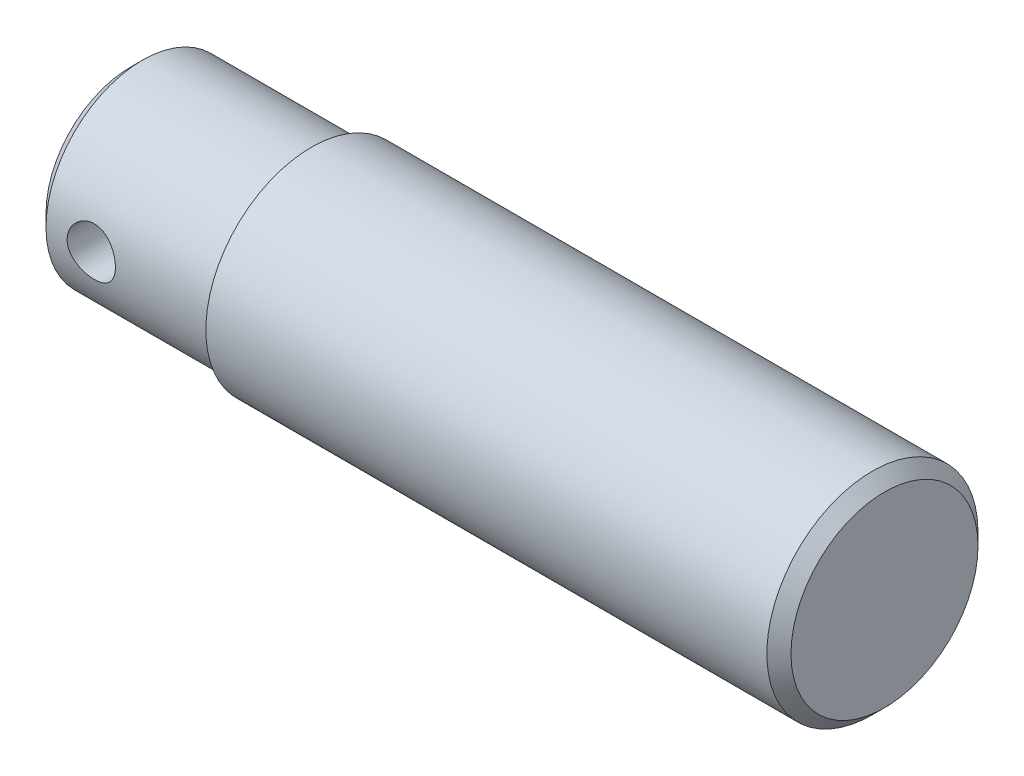
ISO-10303-21;
HEADER;
FILE_DESCRIPTION(('STEP AP214'),'2;1');
FILE_NAME('part.step','',(''),(''),'','','');
FILE_SCHEMA(('AUTOMOTIVE_DESIGN { 1 0 10303 214 1 1 1 1 }'));
ENDSEC;
DATA;
#1=APPLICATION_CONTEXT('core data for automotive mechanical design processes');
#2=APPLICATION_PROTOCOL_DEFINITION('international standard','automotive_design',2000,#1);
#3=PRODUCT_CONTEXT('',#1,'mechanical');
#4=PRODUCT('Part','Part','',(#3));
#5=PRODUCT_RELATED_PRODUCT_CATEGORY('part','',(#4));
#6=PRODUCT_DEFINITION_FORMATION('','',#4);
#7=PRODUCT_DEFINITION_CONTEXT('part definition',#1,'design');
#8=PRODUCT_DEFINITION('design','',#6,#7);
#9=PRODUCT_DEFINITION_SHAPE('','',#8);
#10=(LENGTH_UNIT() NAMED_UNIT(*) SI_UNIT(.MILLI.,.METRE.));
#11=(NAMED_UNIT(*) PLANE_ANGLE_UNIT() SI_UNIT($,.RADIAN.));
#12=(NAMED_UNIT(*) SI_UNIT($,.STERADIAN.) SOLID_ANGLE_UNIT());
#13=UNCERTAINTY_MEASURE_WITH_UNIT(LENGTH_MEASURE(1.E-05),#10,'distance_accuracy_value','');
#14=(GEOMETRIC_REPRESENTATION_CONTEXT(3) GLOBAL_UNCERTAINTY_ASSIGNED_CONTEXT((#13)) GLOBAL_UNIT_ASSIGNED_CONTEXT((#10,
#11,#12)) REPRESENTATION_CONTEXT('',''));
#15=CARTESIAN_POINT('',(0.,0.,0.));
#16=DIRECTION('',(0.,0.,1.));
#17=DIRECTION('',(1.,0.,0.));
#18=AXIS2_PLACEMENT_3D('',#15,#16,#17);
#19=CARTESIAN_POINT('',(0.,0.,0.));
#20=DIRECTION('',(1.,0.,0.));
#21=DIRECTION('',(0.,0.,-1.));
#22=AXIS2_PLACEMENT_3D('',#19,#20,#21);
#23=PLANE('',#22);
#24=CARTESIAN_POINT('',(0.,0.,0.));
#25=DIRECTION('',(1.,0.,0.));
#26=DIRECTION('',(0.,0.,-1.));
#27=AXIS2_PLACEMENT_3D('',#24,#25,#26);
#28=CIRCLE('',#27,17.5);
#29=CARTESIAN_POINT('',(0.,0.,-17.5));
#30=VERTEX_POINT('',#29);
#31=EDGE_CURVE('E120',#30,#30,#28,.T.);
#32=ORIENTED_EDGE('',*,*,#31,.F.);
#33=EDGE_LOOP('',(#32));
#34=FACE_BOUND('',#33,.T.);
#35=CARTESIAN_POINT('',(0.,0.,0.));
#36=DIRECTION('',(1.,0.,0.));
#37=DIRECTION('',(0.,0.,-1.));
#38=AXIS2_PLACEMENT_3D('',#35,#36,#37);
#39=CIRCLE('',#38,16.);
#40=CARTESIAN_POINT('',(0.,0.,-16.));
#41=VERTEX_POINT('',#40);
#42=EDGE_CURVE('E113',#41,#41,#39,.F.);
#43=ORIENTED_EDGE('',*,*,#42,.F.);
#44=EDGE_LOOP('',(#43));
#45=FACE_BOUND('',#44,.T.);
#46=ADVANCED_FACE('F43',(#34,#45),#23,.F.);
#47=CARTESIAN_POINT('',(95.,0.,0.));
#48=DIRECTION('',(-1.,0.,0.));
#49=DIRECTION('',(0.,0.,1.));
#50=AXIS2_PLACEMENT_3D('',#47,#48,#49);
#51=CYLINDRICAL_SURFACE('',#50,17.5);
#52=CARTESIAN_POINT('',(93.,0.,0.));
#53=DIRECTION('',(1.,0.,0.));
#54=DIRECTION('',(0.,0.,-1.));
#55=AXIS2_PLACEMENT_3D('',#52,#53,#54);
#56=CIRCLE('',#55,17.5);
#57=CARTESIAN_POINT('',(93.,0.,-17.5));
#58=VERTEX_POINT('',#57);
#59=EDGE_CURVE('E64',#58,#58,#56,.F.);
#60=ORIENTED_EDGE('',*,*,#59,.T.);
#61=EDGE_LOOP('',(#60));
#62=FACE_BOUND('',#61,.T.);
#63=ORIENTED_EDGE('',*,*,#31,.T.);
#64=EDGE_LOOP('',(#63));
#65=FACE_BOUND('',#64,.T.);
#66=ADVANCED_FACE('F94',(#62,#65),#51,.T.);
#67=CARTESIAN_POINT('',(95.,0.,0.));
#68=DIRECTION('',(1.,0.,0.));
#69=DIRECTION('',(0.,0.,-1.));
#70=AXIS2_PLACEMENT_3D('',#67,#68,#69);
#71=PLANE('',#70);
#72=CARTESIAN_POINT('',(95.,0.,0.));
#73=DIRECTION('',(1.,0.,0.));
#74=DIRECTION('',(0.,0.,-1.));
#75=AXIS2_PLACEMENT_3D('',#72,#73,#74);
#76=CIRCLE('',#75,15.5);
#77=CARTESIAN_POINT('',(95.,0.,-15.5));
#78=VERTEX_POINT('',#77);
#79=EDGE_CURVE('E110',#78,#78,#76,.T.);
#80=ORIENTED_EDGE('',*,*,#79,.T.);
#81=EDGE_LOOP('',(#80));
#82=FACE_BOUND('',#81,.T.);
#83=ADVANCED_FACE('F91',(#82),#71,.T.);
#84=CARTESIAN_POINT('',(-30.,0.,0.));
#85=DIRECTION('',(1.,0.,0.));
#86=DIRECTION('',(0.,0.,-1.));
#87=AXIS2_PLACEMENT_3D('',#84,#85,#86);
#88=CYLINDRICAL_SURFACE('',#87,16.);
#89=CARTESIAN_POINT('',(-24.5,0.,-16.));
#90=CARTESIAN_POINT('',(-24.4999937980316,-0.221002903119282,-15.999996263147));
#91=CARTESIAN_POINT('',(-24.4816225312699,-0.442075087548701,-15.9953754168487));
#92=CARTESIAN_POINT('',(-24.408732929848,-0.877883530054753,-15.9773897021305));
#93=CARTESIAN_POINT('',(-24.3541941078991,-1.09261612498864,-15.964019877866));
#94=CARTESIAN_POINT('',(-24.2108286574344,-1.50938899248687,-15.9300167021875));
#95=CARTESIAN_POINT('',(-24.1220432034259,-1.71144416914667,-15.9093920757882));
#96=CARTESIAN_POINT('',(-23.9128496265471,-2.09779235174514,-15.8630758348699));
#97=CARTESIAN_POINT('',(-23.7924404370161,-2.28208475826337,-15.8373840494442));
#98=CARTESIAN_POINT('',(-23.5207978942555,-2.63147180613577,-15.7831310291118));
#99=CARTESIAN_POINT('',(-23.3690358001092,-2.79614850682948,-15.75452552395));
#100=CARTESIAN_POINT('',(-23.0401274535759,-3.09799713920885,-15.697963203145));
#101=CARTESIAN_POINT('',(-22.8629783388082,-3.23516596519784,-15.6700064610631));
#102=CARTESIAN_POINT('',(-22.485079395368,-3.48007078079727,-15.6174606852845));
#103=CARTESIAN_POINT('',(-22.2840180511767,-3.58733924246704,-15.592927852395));
#104=CARTESIAN_POINT('',(-21.8660042355732,-3.76639175613532,-15.5506531951471));
#105=CARTESIAN_POINT('',(-21.6490543111146,-3.83818148117371,-15.5329102851845));
#106=CARTESIAN_POINT('',(-21.2100173381289,-3.94281289814604,-15.5066793785686));
#107=CARTESIAN_POINT('',(-20.988120277232,-3.97640604888548,-15.4980130932536));
#108=CARTESIAN_POINT('',(-20.5416838160017,-4.00603140017709,-15.4903829989224));
#109=CARTESIAN_POINT('',(-20.3171448514876,-4.00206971151497,-15.4914176114114));
#110=CARTESIAN_POINT('',(-19.8775578460124,-3.95729739903922,-15.5029121471151));
#111=CARTESIAN_POINT('',(-19.6624116760925,-3.91738224050836,-15.5131430135278));
#112=CARTESIAN_POINT('',(-19.2419705309038,-3.80326449840798,-15.5415122578952));
#113=CARTESIAN_POINT('',(-19.0366762585895,-3.72905947218505,-15.5596511991797));
#114=CARTESIAN_POINT('',(-18.6393652899943,-3.54770527449916,-15.6020030374842));
#115=CARTESIAN_POINT('',(-18.4475035418945,-3.44023111262112,-15.6262753991951));
#116=CARTESIAN_POINT('',(-18.0842167739818,-3.19561673603986,-15.6781256225598));
#117=CARTESIAN_POINT('',(-17.9127953384873,-3.0584713301569,-15.7057040622567));
#118=CARTESIAN_POINT('',(-17.5901236914816,-2.75376913248326,-15.7620234810638));
#119=CARTESIAN_POINT('',(-17.4395880265031,-2.5854566884423,-15.79077518608));
#120=CARTESIAN_POINT('',(-17.1687433534296,-2.22563178000987,-15.8454924154335));
#121=CARTESIAN_POINT('',(-17.0484352686305,-2.03411860722119,-15.8714578546509));
#122=CARTESIAN_POINT('',(-16.841198436735,-1.63230903648372,-15.9178061891784));
#123=CARTESIAN_POINT('',(-16.7543857593215,-1.42195038188967,-15.9381696034061));
#124=CARTESIAN_POINT('',(-16.6175538514411,-0.989002688381027,-15.9708777864378));
#125=CARTESIAN_POINT('',(-16.567527582885,-0.766415997734632,-15.9832240890475));
#126=CARTESIAN_POINT('',(-16.5067798251764,-0.321439921040078,-15.99827998057));
#127=CARTESIAN_POINT('',(-16.4950852637992,-0.0991912533018998,-16.0012280935541));
#128=CARTESIAN_POINT('',(-16.5086640054813,0.344087666137349,-15.9978347950521));
#129=CARTESIAN_POINT('',(-16.5339339807977,0.565118025718916,-15.9914942197827));
#130=CARTESIAN_POINT('',(-16.619922422377,0.9963047167373,-15.9703888300627));
#131=CARTESIAN_POINT('',(-16.6801100359386,1.20657365058333,-15.9557502449543));
#132=CARTESIAN_POINT('',(-16.8336188907426,1.61401944654004,-15.9196988435776));
#133=CARTESIAN_POINT('',(-16.9269434781686,1.81119498408706,-15.8982853431996));
#134=CARTESIAN_POINT('',(-17.1459630103325,2.19072835847954,-15.8504882113658));
#135=CARTESIAN_POINT('',(-17.2722029663908,2.3727611782287,-15.8240231297755));
#136=CARTESIAN_POINT('',(-17.5527730901258,2.71340430304882,-15.7691869116739));
#137=CARTESIAN_POINT('',(-17.707108105647,2.872010557262,-15.7408154467472));
#138=CARTESIAN_POINT('',(-18.0440052289166,3.16530818152661,-15.684505518918));
#139=CARTESIAN_POINT('',(-18.227167207999,3.29931698032289,-15.656594778192));
#140=CARTESIAN_POINT('',(-18.6139536919161,3.53469535736971,-15.6051434235286));
#141=CARTESIAN_POINT('',(-18.8175772879206,3.63606638443058,-15.5816026156269));
#142=CARTESIAN_POINT('',(-19.2384152597505,3.8025371216194,-15.541815859087));
#143=CARTESIAN_POINT('',(-19.4555403421681,3.86785172438227,-15.52552680591));
#144=CARTESIAN_POINT('',(-19.8981590342788,3.96092175984845,-15.5020465074083));
#145=CARTESIAN_POINT('',(-20.1236508027163,3.98868540660476,-15.4948532724486));
#146=CARTESIAN_POINT('',(-20.5696560636477,4.00543624089542,-15.4905306988529));
#147=CARTESIAN_POINT('',(-20.7901264937165,3.99551439407292,-15.493118204836));
#148=CARTESIAN_POINT('',(-21.2261437031512,3.93967274215723,-15.5074109053851));
#149=CARTESIAN_POINT('',(-21.4416905813756,3.89375366049685,-15.5191159167174));
#150=CARTESIAN_POINT('',(-21.8605558908267,3.76781685185121,-15.550166951935));
#151=CARTESIAN_POINT('',(-22.0639394806367,3.68800374581534,-15.5694670730744));
#152=CARTESIAN_POINT('',(-22.454574353907,3.49670643627917,-15.6135401525559));
#153=CARTESIAN_POINT('',(-22.6418233951662,3.38521784009089,-15.6383138698585));
#154=CARTESIAN_POINT('',(-23.0001456773376,3.13031399636597,-15.6913502470565));
#155=CARTESIAN_POINT('',(-23.1706695291303,2.98614176776608,-15.7196870621881));
#156=CARTESIAN_POINT('',(-23.4854587861214,2.67143832317255,-15.776214059893));
#157=CARTESIAN_POINT('',(-23.629717946968,2.50090085669637,-15.8044042060528));
#158=CARTESIAN_POINT('',(-23.8904301561722,2.13458023120693,-15.8580708172732));
#159=CARTESIAN_POINT('',(-24.0063323031242,1.9383957928437,-15.8834888897571));
#160=CARTESIAN_POINT('',(-24.2033265678414,1.52870949202793,-15.9281313326692));
#161=CARTESIAN_POINT('',(-24.2844436283961,1.31522016916464,-15.9473601386607));
#162=CARTESIAN_POINT('',(-24.3975248808791,0.918427341982592,-15.9746149217479));
#163=CARTESIAN_POINT('',(-24.4358699814758,0.737013789088183,-15.9840689347384));
#164=CARTESIAN_POINT('',(-24.4871091829918,0.370416190763421,-15.9967628061853));
#165=CARTESIAN_POINT('',(-24.5000051981475,0.18523242998031,-16.0000031320238));
#166=CARTESIAN_POINT('',(-24.5,0.,-16.));
#167=B_SPLINE_CURVE_WITH_KNOTS('',3,(#89,#90,#91,#92,#93,#94,#95,#96,#97,#98,#99,#100,#101,#102,
#103,#104,#105,#106,#107,#108,#109,#110,#111,#112,#113,#114,#115,#116,#117,#118,#119,#120,#121,
#122,#123,#124,#125,#126,#127,#128,#129,#130,#131,#132,#133,#134,#135,#136,#137,#138,#139,#140,
#141,#142,#143,#144,#145,#146,#147,#148,#149,#150,#151,#152,#153,#154,#155,#156,#157,#158,#159,
#160,#161,#162,#163,#164,#165,#166),.UNSPECIFIED.,.T.,.F.,(4,2,2,2,2,2,2,2,2,2,2,2,2,2,2,2,2,2,
2,2,2,2,2,2,2,2,2,2,2,2,2,2,2,2,2,2,2,2,4),(0.,0.662329899925039,1.32503530070373,
1.98694640609628,2.64887984045154,3.32305161165704,3.99729945546832,4.68156393455485,
5.36571896451649,6.03616786936187,6.7065076830938,7.3605999202757,8.01473875918291,
8.67548074339199,9.33633842238622,10.0160400259291,10.6957623883085,11.3778194403316,
12.059745965119,12.7242215720692,13.388637363095,14.0432073204629,14.6978433953496,
15.3640956684979,16.0304630136357,16.7131869122079,17.3958805000754,18.0744601231622,
18.7528912868876,19.4118341441481,20.0707637590396,20.7257706817973,21.3808684838628,
22.053055371143,22.7254018607565,23.4099249468677,24.0939563687814,24.6491264786694,
25.2042548280264),.UNSPECIFIED.);
#168=CARTESIAN_POINT('',(-24.5,0.,-16.));
#169=VERTEX_POINT('',#168);
#170=EDGE_CURVE('E47',#169,#169,#167,.T.);
#171=ORIENTED_EDGE('',*,*,#170,.T.);
#172=EDGE_LOOP('',(#171));
#173=FACE_BOUND('',#172,.T.);
#174=CARTESIAN_POINT('',(-16.5,0.,16.));
#175=CARTESIAN_POINT('',(-16.5000062019684,-0.221002903119286,15.999996263147));
#176=CARTESIAN_POINT('',(-16.5183774687301,-0.442075087548705,15.9953754168487));
#177=CARTESIAN_POINT('',(-16.591267070152,-0.877883530054757,15.9773897021305));
#178=CARTESIAN_POINT('',(-16.6458058921009,-1.09261612498864,15.964019877866));
#179=CARTESIAN_POINT('',(-16.7891713425656,-1.50938899248687,15.9300167021875));
#180=CARTESIAN_POINT('',(-16.877956796574,-1.71144416914667,15.9093920757882));
#181=CARTESIAN_POINT('',(-17.0871503734529,-2.09779235174514,15.8630758348699));
#182=CARTESIAN_POINT('',(-17.2075595629839,-2.28208475826337,15.8373840494442));
#183=CARTESIAN_POINT('',(-17.4792021057445,-2.63147180613578,15.7831310291118));
#184=CARTESIAN_POINT('',(-17.6309641998908,-2.79614850682949,15.75452552395));
#185=CARTESIAN_POINT('',(-17.9598725464241,-3.09799713920886,15.697963203145));
#186=CARTESIAN_POINT('',(-18.1370216611918,-3.23516596519785,15.6700064610631));
#187=CARTESIAN_POINT('',(-18.514920604632,-3.48007078079727,15.6174606852845));
#188=CARTESIAN_POINT('',(-18.7159819488233,-3.58733924246704,15.592927852395));
#189=CARTESIAN_POINT('',(-19.1339957644268,-3.76639175613532,15.5506531951471));
#190=CARTESIAN_POINT('',(-19.3509456888854,-3.83818148117371,15.5329102851845));
#191=CARTESIAN_POINT('',(-19.7899826618711,-3.94281289814604,15.5066793785686));
#192=CARTESIAN_POINT('',(-20.011879722768,-3.97640604888548,15.4980130932536));
#193=CARTESIAN_POINT('',(-20.4583161839983,-4.00603140017709,15.4903829989224));
#194=CARTESIAN_POINT('',(-20.6828551485124,-4.00206971151497,15.4914176114114));
#195=CARTESIAN_POINT('',(-21.1224421539876,-3.95729739903922,15.5029121471151));
#196=CARTESIAN_POINT('',(-21.3375883239075,-3.91738224050836,15.5131430135278));
#197=CARTESIAN_POINT('',(-21.7580294690962,-3.80326449840798,15.5415122578952));
#198=CARTESIAN_POINT('',(-21.9633237414105,-3.72905947218505,15.5596511991797));
#199=CARTESIAN_POINT('',(-22.3606347100057,-3.54770527449916,15.6020030374842));
#200=CARTESIAN_POINT('',(-22.5524964581055,-3.44023111262112,15.6262753991951));
#201=CARTESIAN_POINT('',(-22.9157832260182,-3.19561673603986,15.6781256225598));
#202=CARTESIAN_POINT('',(-23.0872046615127,-3.0584713301569,15.7057040622567));
#203=CARTESIAN_POINT('',(-23.4098763085184,-2.75376913248326,15.7620234810638));
#204=CARTESIAN_POINT('',(-23.5604119734969,-2.5854566884423,15.79077518608));
#205=CARTESIAN_POINT('',(-23.8312566465704,-2.22563178000987,15.8454924154335));
#206=CARTESIAN_POINT('',(-23.9515647313695,-2.03411860722119,15.8714578546509));
#207=CARTESIAN_POINT('',(-24.158801563265,-1.63230903648371,15.9178061891784));
#208=CARTESIAN_POINT('',(-24.2456142406785,-1.42195038188966,15.9381696034061));
#209=CARTESIAN_POINT('',(-24.3824461485589,-0.989002688381022,15.9708777864378));
#210=CARTESIAN_POINT('',(-24.432472417115,-0.766415997734627,15.9832240890475));
#211=CARTESIAN_POINT('',(-24.4932201748236,-0.321439921040074,15.99827998057));
#212=CARTESIAN_POINT('',(-24.5049147362008,-0.0991912533018967,16.0012280935541));
#213=CARTESIAN_POINT('',(-24.4913359945187,0.344087666137352,15.9978347950521));
#214=CARTESIAN_POINT('',(-24.4660660192023,0.56511802571892,15.9914942197827));
#215=CARTESIAN_POINT('',(-24.380077577623,0.996304716737304,15.9703888300627));
#216=CARTESIAN_POINT('',(-24.3198899640614,1.20657365058333,15.9557502449543));
#217=CARTESIAN_POINT('',(-24.1663811092574,1.61401944654004,15.9196988435776));
#218=CARTESIAN_POINT('',(-24.0730565218314,1.81119498408707,15.8982853431996));
#219=CARTESIAN_POINT('',(-23.8540369896675,2.19072835847954,15.8504882113658));
#220=CARTESIAN_POINT('',(-23.7277970336091,2.3727611782287,15.8240231297755));
#221=CARTESIAN_POINT('',(-23.4472269098742,2.71340430304883,15.7691869116739));
#222=CARTESIAN_POINT('',(-23.292891894353,2.872010557262,15.7408154467472));
#223=CARTESIAN_POINT('',(-22.9559947710834,3.16530818152661,15.684505518918));
#224=CARTESIAN_POINT('',(-22.772832792001,3.29931698032289,15.656594778192));
#225=CARTESIAN_POINT('',(-22.3860463080839,3.53469535736971,15.6051434235286));
#226=CARTESIAN_POINT('',(-22.1824227120794,3.63606638443058,15.5816026156269));
#227=CARTESIAN_POINT('',(-21.7615847402495,3.8025371216194,15.541815859087));
#228=CARTESIAN_POINT('',(-21.5444596578318,3.86785172438227,15.52552680591));
#229=CARTESIAN_POINT('',(-21.1018409657212,3.96092175984845,15.5020465074083));
#230=CARTESIAN_POINT('',(-20.8763491972837,3.98868540660476,15.4948532724486));
#231=CARTESIAN_POINT('',(-20.4303439363523,4.00543624089542,15.4905306988529));
#232=CARTESIAN_POINT('',(-20.2098735062835,3.99551439407292,15.493118204836));
#233=CARTESIAN_POINT('',(-19.7738562968488,3.93967274215723,15.5074109053851));
#234=CARTESIAN_POINT('',(-19.5583094186244,3.89375366049685,15.5191159167174));
#235=CARTESIAN_POINT('',(-19.1394441091733,3.76781685185121,15.550166951935));
#236=CARTESIAN_POINT('',(-18.9360605193633,3.68800374581534,15.5694670730744));
#237=CARTESIAN_POINT('',(-18.545425646093,3.49670643627917,15.6135401525559));
#238=CARTESIAN_POINT('',(-18.3581766048338,3.38521784009089,15.6383138698585));
#239=CARTESIAN_POINT('',(-17.9998543226624,3.13031399636597,15.6913502470565));
#240=CARTESIAN_POINT('',(-17.8293304708697,2.98614176776608,15.7196870621881));
#241=CARTESIAN_POINT('',(-17.5145412138786,2.67143832317255,15.776214059893));
#242=CARTESIAN_POINT('',(-17.370282053032,2.50090085669636,15.8044042060528));
#243=CARTESIAN_POINT('',(-17.1095698438278,2.13458023120692,15.8580708172732));
#244=CARTESIAN_POINT('',(-16.9936676968758,1.9383957928437,15.8834888897571));
#245=CARTESIAN_POINT('',(-16.7966734321586,1.52870949202793,15.9281313326692));
#246=CARTESIAN_POINT('',(-16.7155563716039,1.31522016916463,15.9473601386607));
#247=CARTESIAN_POINT('',(-16.6024751191209,0.918427341982587,15.9746149217479));
#248=CARTESIAN_POINT('',(-16.5641300185242,0.737013789088178,15.9840689347384));
#249=CARTESIAN_POINT('',(-16.5128908170082,0.370416190763418,15.9967628061853));
#250=CARTESIAN_POINT('',(-16.4999948018525,0.185232429980306,16.0000031320238));
#251=CARTESIAN_POINT('',(-16.5,0.,16.));
#252=B_SPLINE_CURVE_WITH_KNOTS('',3,(#174,#175,#176,#177,#178,#179,#180,#181,#182,#183,#184,
#185,#186,#187,#188,#189,#190,#191,#192,#193,#194,#195,#196,#197,#198,#199,#200,#201,#202,#203,
#204,#205,#206,#207,#208,#209,#210,#211,#212,#213,#214,#215,#216,#217,#218,#219,#220,#221,#222,
#223,#224,#225,#226,#227,#228,#229,#230,#231,#232,#233,#234,#235,#236,#237,#238,#239,#240,#241,
#242,#243,#244,#245,#246,#247,#248,#249,#250,#251),.UNSPECIFIED.,.T.,.F.,(4,2,2,2,2,2,2,2,2,2,2,
2,2,2,2,2,2,2,2,2,2,2,2,2,2,2,2,2,2,2,2,2,2,2,2,2,2,2,4),(0.,0.662329899925039,1.32503530070373,
1.98694640609628,2.64887984045154,3.32305161165704,3.99729945546832,4.68156393455485,
5.36571896451649,6.03616786936186,6.7065076830938,7.3605999202757,8.01473875918291,
8.675480743392,9.33633842238622,10.0160400259291,10.6957623883085,11.3778194403316,
12.059745965119,12.7242215720692,13.388637363095,14.0432073204629,14.6978433953496,
15.3640956684979,16.0304630136357,16.7131869122079,17.3958805000754,18.0744601231622,
18.7528912868876,19.4118341441481,20.0707637590396,20.7257706817973,21.3808684838628,
22.053055371143,22.7254018607565,23.4099249468677,24.0939563687814,24.6491264786694,
25.2042548280264),.UNSPECIFIED.);
#253=CARTESIAN_POINT('',(-16.5,0.,16.));
#254=VERTEX_POINT('',#253);
#255=EDGE_CURVE('E67',#254,#254,#252,.T.);
#256=ORIENTED_EDGE('',*,*,#255,.T.);
#257=EDGE_LOOP('',(#256));
#258=FACE_BOUND('',#257,.T.);
#259=CARTESIAN_POINT('',(-28.,0.,0.));
#260=DIRECTION('',(-1.,0.,0.));
#261=DIRECTION('',(0.,0.,1.));
#262=AXIS2_PLACEMENT_3D('',#259,#260,#261);
#263=CIRCLE('',#262,16.);
#264=CARTESIAN_POINT('',(-28.,0.,16.));
#265=VERTEX_POINT('',#264);
#266=EDGE_CURVE('E10',#265,#265,#263,.F.);
#267=ORIENTED_EDGE('',*,*,#266,.T.);
#268=EDGE_LOOP('',(#267));
#269=FACE_BOUND('',#268,.T.);
#270=ORIENTED_EDGE('',*,*,#42,.T.);
#271=EDGE_LOOP('',(#270));
#272=FACE_BOUND('',#271,.T.);
#273=ADVANCED_FACE('F73',(#173,#258,#269,#272),#88,.T.);
#274=CARTESIAN_POINT('',(-30.,0.,0.));
#275=DIRECTION('',(-1.,0.,0.));
#276=DIRECTION('',(0.,0.,1.));
#277=AXIS2_PLACEMENT_3D('',#274,#275,#276);
#278=PLANE('',#277);
#279=CARTESIAN_POINT('',(-30.,0.,0.));
#280=DIRECTION('',(-1.,0.,0.));
#281=DIRECTION('',(0.,0.,1.));
#282=AXIS2_PLACEMENT_3D('',#279,#280,#281);
#283=CIRCLE('',#282,14.);
#284=CARTESIAN_POINT('',(-30.,0.,14.));
#285=VERTEX_POINT('',#284);
#286=EDGE_CURVE('E57',#285,#285,#283,.T.);
#287=ORIENTED_EDGE('',*,*,#286,.T.);
#288=EDGE_LOOP('',(#287));
#289=FACE_BOUND('',#288,.T.);
#290=ADVANCED_FACE('F81',(#289),#278,.T.);
#291=CARTESIAN_POINT('',(95.,0.,0.));
#292=DIRECTION('',(-1.,0.,0.));
#293=DIRECTION('',(0.,0.,1.));
#294=AXIS2_PLACEMENT_3D('',#291,#292,#293);
#295=CONICAL_SURFACE('',#294,15.5,0.785398163397449);
#296=ORIENTED_EDGE('',*,*,#59,.F.);
#297=EDGE_LOOP('',(#296));
#298=FACE_BOUND('',#297,.T.);
#299=ORIENTED_EDGE('',*,*,#79,.F.);
#300=EDGE_LOOP('',(#299));
#301=FACE_BOUND('',#300,.T.);
#302=ADVANCED_FACE('F84',(#298,#301),#295,.T.);
#303=CARTESIAN_POINT('',(-30.,0.,0.));
#304=DIRECTION('',(1.,0.,0.));
#305=DIRECTION('',(0.,0.,-1.));
#306=AXIS2_PLACEMENT_3D('',#303,#304,#305);
#307=CONICAL_SURFACE('',#306,14.,0.785398163397446);
#308=ORIENTED_EDGE('',*,*,#266,.F.);
#309=EDGE_LOOP('',(#308));
#310=FACE_BOUND('',#309,.T.);
#311=ORIENTED_EDGE('',*,*,#286,.F.);
#312=EDGE_LOOP('',(#311));
#313=FACE_BOUND('',#312,.T.);
#314=ADVANCED_FACE('F45',(#310,#313),#307,.T.);
#315=CARTESIAN_POINT('',(-20.5,0.,-17.5));
#316=DIRECTION('',(0.,0.,1.));
#317=DIRECTION('',(1.,0.,0.));
#318=AXIS2_PLACEMENT_3D('',#315,#316,#317);
#319=CYLINDRICAL_SURFACE('',#318,4.);
#320=ORIENTED_EDGE('',*,*,#255,.F.);
#321=EDGE_LOOP('',(#320));
#322=FACE_BOUND('',#321,.T.);
#323=ORIENTED_EDGE('',*,*,#170,.F.);
#324=EDGE_LOOP('',(#323));
#325=FACE_BOUND('',#324,.T.);
#326=ADVANCED_FACE('F77',(#322,#325),#319,.F.);
#327=CLOSED_SHELL('',(#46,#66,#83,#273,#290,#302,#314,#326));
#328=MANIFOLD_SOLID_BREP('B2',#327);
#329=ADVANCED_BREP_SHAPE_REPRESENTATION('',(#18,#328),#14);
#330=SHAPE_DEFINITION_REPRESENTATION(#9,#329);
ENDSEC;
END-ISO-10303-21;
